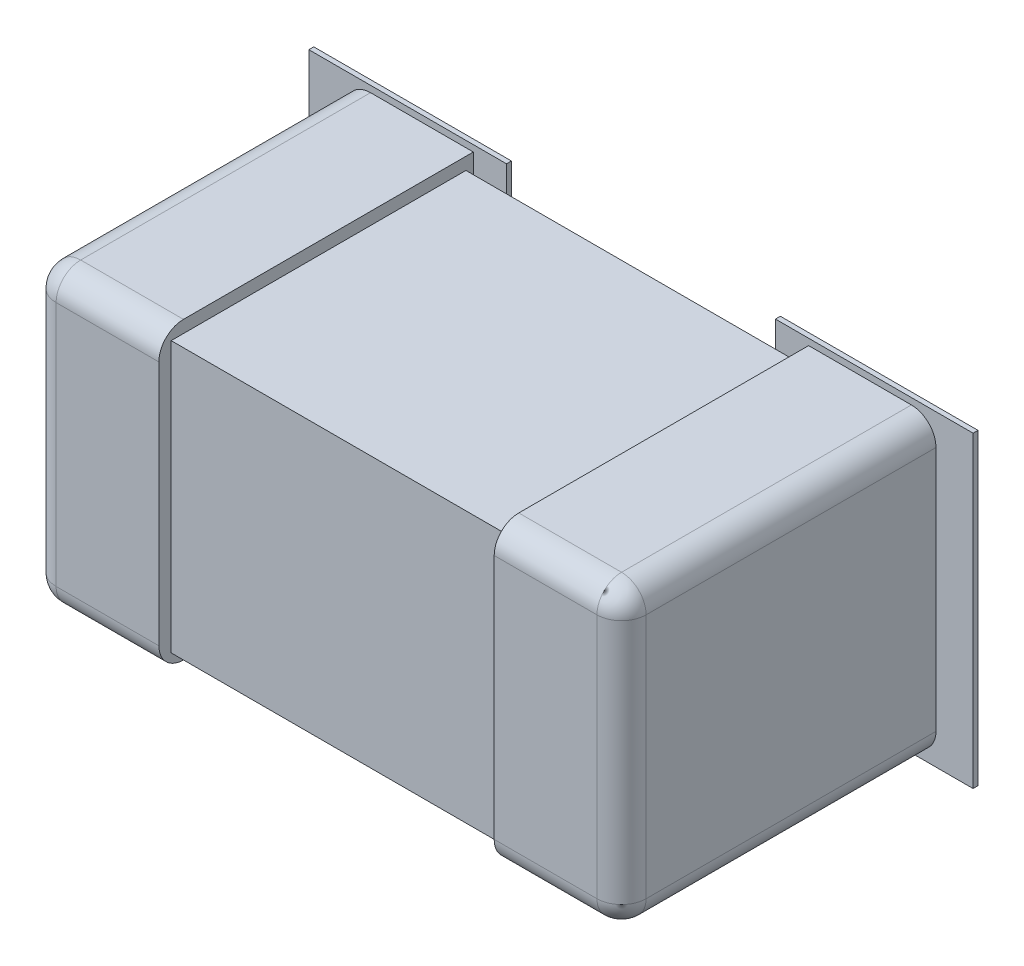
ISO-10303-21;
HEADER;
FILE_DESCRIPTION(('STEP AP214'),'2;1');
FILE_NAME('part.step','',(''),(''),'','','');
FILE_SCHEMA(('AUTOMOTIVE_DESIGN { 1 0 10303 214 1 1 1 1 }'));
ENDSEC;
DATA;
#1=APPLICATION_CONTEXT('core data for automotive mechanical design processes');
#2=APPLICATION_PROTOCOL_DEFINITION('international standard','automotive_design',2000,#1);
#3=PRODUCT_CONTEXT('',#1,'mechanical');
#4=PRODUCT('Part','Part','',(#3));
#5=PRODUCT_RELATED_PRODUCT_CATEGORY('part','',(#4));
#6=PRODUCT_DEFINITION_FORMATION('','',#4);
#7=PRODUCT_DEFINITION_CONTEXT('part definition',#1,'design');
#8=PRODUCT_DEFINITION('design','',#6,#7);
#9=PRODUCT_DEFINITION_SHAPE('','',#8);
#10=(LENGTH_UNIT() NAMED_UNIT(*) SI_UNIT(.MILLI.,.METRE.));
#11=(NAMED_UNIT(*) PLANE_ANGLE_UNIT() SI_UNIT($,.RADIAN.));
#12=(NAMED_UNIT(*) SI_UNIT($,.STERADIAN.) SOLID_ANGLE_UNIT());
#13=UNCERTAINTY_MEASURE_WITH_UNIT(LENGTH_MEASURE(1.E-05),#10,'distance_accuracy_value','');
#14=(GEOMETRIC_REPRESENTATION_CONTEXT(3) GLOBAL_UNCERTAINTY_ASSIGNED_CONTEXT((#13)) GLOBAL_UNIT_ASSIGNED_CONTEXT((#10,
#11,#12)) REPRESENTATION_CONTEXT('',''));
#15=CARTESIAN_POINT('',(0.,0.,0.));
#16=DIRECTION('',(0.,0.,1.));
#17=DIRECTION('',(1.,0.,0.));
#18=AXIS2_PLACEMENT_3D('',#15,#16,#17);
#19=CARTESIAN_POINT('',(0.,0.,0.0762));
#20=DIRECTION('',(0.,0.,1.));
#21=DIRECTION('',(1.,0.,0.));
#22=AXIS2_PLACEMENT_3D('',#19,#20,#21);
#23=PLANE('',#22);
#24=DIRECTION('',(1.,0.,0.));
#25=VECTOR('',#24,1.);
#26=CARTESIAN_POINT('',(0.138938,-0.159004,0.0762));
#27=LINE('',#26,#25);
#28=CARTESIAN_POINT('',(0.138938,-0.159004,0.0762));
#29=VERTEX_POINT('',#28);
#30=CARTESIAN_POINT('',(0.343154,-0.159004,0.0762));
#31=VERTEX_POINT('',#30);
#32=EDGE_CURVE('E341',#29,#31,#27,.T.);
#33=ORIENTED_EDGE('',*,*,#32,.F.);
#34=DIRECTION('',(0.,1.,0.));
#35=VECTOR('',#34,1.);
#36=CARTESIAN_POINT('',(0.138938,0.159004,0.0762));
#37=LINE('',#36,#35);
#38=CARTESIAN_POINT('',(0.138938,0.159004,0.0762));
#39=VERTEX_POINT('',#38);
#40=EDGE_CURVE('E347',#39,#29,#37,.F.);
#41=ORIENTED_EDGE('',*,*,#40,.F.);
#42=DIRECTION('',(1.,0.,0.));
#43=VECTOR('',#42,1.);
#44=CARTESIAN_POINT('',(0.343154,0.159004,0.0762));
#45=LINE('',#44,#43);
#46=CARTESIAN_POINT('',(0.343154,0.159004,0.0762));
#47=VERTEX_POINT('',#46);
#48=EDGE_CURVE('E326',#47,#39,#45,.F.);
#49=ORIENTED_EDGE('',*,*,#48,.F.);
#50=DIRECTION('',(0.,1.,0.));
#51=VECTOR('',#50,1.);
#52=CARTESIAN_POINT('',(0.343154,-0.159004,0.0762));
#53=LINE('',#52,#51);
#54=EDGE_CURVE('E335',#31,#47,#53,.T.);
#55=ORIENTED_EDGE('',*,*,#54,.F.);
#56=EDGE_LOOP('',(#33,#41,#49,#55));
#57=FACE_BOUND('',#56,.T.);
#58=ADVANCED_FACE('F17',(#57),#23,.F.);
#59=CARTESIAN_POINT('',(0.2794,0.127,0.380746));
#60=DIRECTION('',(0.,0.707106781186548,0.707106781186548));
#61=DIRECTION('',(1.,0.,0.));
#62=AXIS2_PLACEMENT_3D('',#59,#60,#61);
#63=SPHERICAL_SURFACE('',#62,0.0254);
#64=CARTESIAN_POINT('',(0.2794,0.127,0.380746));
#65=DIRECTION('',(-1.,0.,0.));
#66=DIRECTION('',(0.,0.,1.));
#67=AXIS2_PLACEMENT_3D('',#64,#65,#66);
#68=CIRCLE('',#67,0.0254);
#69=CARTESIAN_POINT('',(0.2794,0.127,0.406146));
#70=VERTEX_POINT('',#69);
#71=CARTESIAN_POINT('',(0.2794,0.144960512242138,0.398706512242138));
#72=VERTEX_POINT('',#71);
#73=EDGE_CURVE('E313',#70,#72,#68,.T.);
#74=ORIENTED_EDGE('',*,*,#73,.F.);
#75=CARTESIAN_POINT('',(0.2794,0.127,0.380746));
#76=DIRECTION('',(0.,1.,0.));
#77=DIRECTION('',(0.,0.,1.));
#78=AXIS2_PLACEMENT_3D('',#75,#76,#77);
#79=CIRCLE('',#78,0.0254);
#80=CARTESIAN_POINT('',(0.3048,0.127,0.380746));
#81=VERTEX_POINT('',#80);
#82=EDGE_CURVE('E319',#81,#70,#79,.F.);
#83=ORIENTED_EDGE('',*,*,#82,.F.);
#84=CARTESIAN_POINT('',(0.2794,0.127,0.380746));
#85=DIRECTION('',(0.,0.,-1.));
#86=DIRECTION('',(-1.,0.,0.));
#87=AXIS2_PLACEMENT_3D('',#84,#85,#86);
#88=CIRCLE('',#87,0.0254);
#89=CARTESIAN_POINT('',(0.2794,0.1524,0.380746));
#90=VERTEX_POINT('',#89);
#91=EDGE_CURVE('E20',#90,#81,#88,.T.);
#92=ORIENTED_EDGE('',*,*,#91,.F.);
#93=CARTESIAN_POINT('',(0.2794,0.127,0.380746));
#94=DIRECTION('',(-1.,0.,0.));
#95=DIRECTION('',(0.,0.,1.));
#96=AXIS2_PLACEMENT_3D('',#93,#94,#95);
#97=CIRCLE('',#96,0.0254);
#98=EDGE_CURVE('E56',#72,#90,#97,.T.);
#99=ORIENTED_EDGE('',*,*,#98,.F.);
#100=EDGE_LOOP('',(#74,#83,#92,#99));
#101=FACE_BOUND('',#100,.T.);
#102=ADVANCED_FACE('F373',(#101),#63,.T.);
#103=CARTESIAN_POINT('',(0.2794,-0.127,0.380746));
#104=DIRECTION('',(0.707106781186548,0.,0.707106781186548));
#105=DIRECTION('',(0.,-1.,0.));
#106=AXIS2_PLACEMENT_3D('',#103,#104,#105);
#107=SPHERICAL_SURFACE('',#106,0.0254);
#108=CARTESIAN_POINT('',(0.2794,-0.127,0.380746));
#109=DIRECTION('',(0.,1.,0.));
#110=DIRECTION('',(0.,0.,1.));
#111=AXIS2_PLACEMENT_3D('',#108,#109,#110);
#112=CIRCLE('',#111,0.0254);
#113=CARTESIAN_POINT('',(0.2794,-0.127,0.406146));
#114=VERTEX_POINT('',#113);
#115=CARTESIAN_POINT('',(0.297360512242138,-0.127,0.398706512242138));
#116=VERTEX_POINT('',#115);
#117=EDGE_CURVE('E35',#114,#116,#112,.T.);
#118=ORIENTED_EDGE('',*,*,#117,.F.);
#119=CARTESIAN_POINT('',(0.2794,-0.127,0.380746));
#120=DIRECTION('',(1.,0.,0.));
#121=DIRECTION('',(0.,0.,-1.));
#122=AXIS2_PLACEMENT_3D('',#119,#120,#121);
#123=CIRCLE('',#122,0.0254);
#124=CARTESIAN_POINT('',(0.2794,-0.1524,0.380746));
#125=VERTEX_POINT('',#124);
#126=EDGE_CURVE('E398',#125,#114,#123,.F.);
#127=ORIENTED_EDGE('',*,*,#126,.F.);
#128=CARTESIAN_POINT('',(0.2794,-0.127,0.380746));
#129=DIRECTION('',(0.,0.,-1.));
#130=DIRECTION('',(-1.,0.,0.));
#131=AXIS2_PLACEMENT_3D('',#128,#129,#130);
#132=CIRCLE('',#131,0.0254);
#133=CARTESIAN_POINT('',(0.3048,-0.127,0.380746));
#134=VERTEX_POINT('',#133);
#135=EDGE_CURVE('E323',#134,#125,#132,.T.);
#136=ORIENTED_EDGE('',*,*,#135,.F.);
#137=CARTESIAN_POINT('',(0.2794,-0.127,0.380746));
#138=DIRECTION('',(0.,1.,0.));
#139=DIRECTION('',(0.,0.,1.));
#140=AXIS2_PLACEMENT_3D('',#137,#138,#139);
#141=CIRCLE('',#140,0.0254);
#142=EDGE_CURVE('E318',#116,#134,#141,.T.);
#143=ORIENTED_EDGE('',*,*,#142,.F.);
#144=EDGE_LOOP('',(#118,#127,#136,#143));
#145=FACE_BOUND('',#144,.T.);
#146=ADVANCED_FACE('F369',(#145),#107,.T.);
#147=CARTESIAN_POINT('',(0.,0.,0.0762));
#148=DIRECTION('',(0.,0.,1.));
#149=DIRECTION('',(1.,0.,0.));
#150=AXIS2_PLACEMENT_3D('',#147,#148,#149);
#151=PLANE('',#150);
#152=DIRECTION('',(1.,0.,0.));
#153=VECTOR('',#152,1.);
#154=CARTESIAN_POINT('',(-0.138938,0.159004,0.0762));
#155=LINE('',#154,#153);
#156=CARTESIAN_POINT('',(-0.138938,0.159004,0.0762));
#157=VERTEX_POINT('',#156);
#158=CARTESIAN_POINT('',(-0.343154,0.159004,0.0762));
#159=VERTEX_POINT('',#158);
#160=EDGE_CURVE('E302',#157,#159,#155,.F.);
#161=ORIENTED_EDGE('',*,*,#160,.F.);
#162=DIRECTION('',(0.,1.,0.));
#163=VECTOR('',#162,1.);
#164=CARTESIAN_POINT('',(-0.138938,-0.159004,0.0762));
#165=LINE('',#164,#163);
#166=CARTESIAN_POINT('',(-0.138938,-0.159004,0.0762));
#167=VERTEX_POINT('',#166);
#168=EDGE_CURVE('E308',#167,#157,#165,.T.);
#169=ORIENTED_EDGE('',*,*,#168,.F.);
#170=DIRECTION('',(1.,0.,0.));
#171=VECTOR('',#170,1.);
#172=CARTESIAN_POINT('',(-0.343154,-0.159004,0.0762));
#173=LINE('',#172,#171);
#174=CARTESIAN_POINT('',(-0.343154,-0.159004,0.0762));
#175=VERTEX_POINT('',#174);
#176=EDGE_CURVE('E287',#175,#167,#173,.T.);
#177=ORIENTED_EDGE('',*,*,#176,.F.);
#178=DIRECTION('',(0.,1.,0.));
#179=VECTOR('',#178,1.);
#180=CARTESIAN_POINT('',(-0.343154,0.159004,0.0762));
#181=LINE('',#180,#179);
#182=EDGE_CURVE('E296',#159,#175,#181,.F.);
#183=ORIENTED_EDGE('',*,*,#182,.F.);
#184=EDGE_LOOP('',(#161,#169,#177,#183));
#185=FACE_BOUND('',#184,.T.);
#186=ADVANCED_FACE('F365',(#185),#151,.F.);
#187=CARTESIAN_POINT('',(-0.2794,-0.127,0.380746));
#188=DIRECTION('',(0.,-0.707106781186548,0.707106781186548));
#189=DIRECTION('',(-1.,0.,0.));
#190=AXIS2_PLACEMENT_3D('',#187,#188,#189);
#191=SPHERICAL_SURFACE('',#190,0.0254);
#192=CARTESIAN_POINT('',(-0.2794,-0.127,0.380746));
#193=DIRECTION('',(1.,0.,0.));
#194=DIRECTION('',(0.,0.,-1.));
#195=AXIS2_PLACEMENT_3D('',#192,#193,#194);
#196=CIRCLE('',#195,0.0254);
#197=CARTESIAN_POINT('',(-0.2794,-0.127,0.406146));
#198=VERTEX_POINT('',#197);
#199=CARTESIAN_POINT('',(-0.2794,-0.144960512242138,0.398706512242138));
#200=VERTEX_POINT('',#199);
#201=EDGE_CURVE('E271',#198,#200,#196,.T.);
#202=ORIENTED_EDGE('',*,*,#201,.F.);
#203=CARTESIAN_POINT('',(-0.2794,-0.127,0.380746));
#204=DIRECTION('',(0.,-1.,0.));
#205=DIRECTION('',(0.,0.,-1.));
#206=AXIS2_PLACEMENT_3D('',#203,#204,#205);
#207=CIRCLE('',#206,0.0254);
#208=CARTESIAN_POINT('',(-0.3048,-0.127,0.380746));
#209=VERTEX_POINT('',#208);
#210=EDGE_CURVE('E285',#209,#198,#207,.F.);
#211=ORIENTED_EDGE('',*,*,#210,.F.);
#212=CARTESIAN_POINT('',(-0.2794,-0.127,0.380746));
#213=DIRECTION('',(0.,0.,-1.));
#214=DIRECTION('',(-1.,0.,0.));
#215=AXIS2_PLACEMENT_3D('',#212,#213,#214);
#216=CIRCLE('',#215,0.0254);
#217=CARTESIAN_POINT('',(-0.2794,-0.1524,0.380746));
#218=VERTEX_POINT('',#217);
#219=EDGE_CURVE('E286',#218,#209,#216,.T.);
#220=ORIENTED_EDGE('',*,*,#219,.F.);
#221=CARTESIAN_POINT('',(-0.2794,-0.127,0.380746));
#222=DIRECTION('',(1.,0.,0.));
#223=DIRECTION('',(0.,0.,-1.));
#224=AXIS2_PLACEMENT_3D('',#221,#222,#223);
#225=CIRCLE('',#224,0.0254);
#226=EDGE_CURVE('E273',#200,#218,#225,.T.);
#227=ORIENTED_EDGE('',*,*,#226,.F.);
#228=EDGE_LOOP('',(#202,#211,#220,#227));
#229=FACE_BOUND('',#228,.T.);
#230=ADVANCED_FACE('F360',(#229),#191,.T.);
#231=CARTESIAN_POINT('',(-0.2794,0.127,0.380746));
#232=DIRECTION('',(-0.707106781186548,0.707106781186548,0.));
#233=DIRECTION('',(0.,0.,1.));
#234=AXIS2_PLACEMENT_3D('',#231,#232,#233);
#235=SPHERICAL_SURFACE('',#234,0.0254);
#236=CARTESIAN_POINT('',(-0.2794,0.127,0.380746));
#237=DIRECTION('',(0.,-1.,0.));
#238=DIRECTION('',(0.,0.,-1.));
#239=AXIS2_PLACEMENT_3D('',#236,#237,#238);
#240=CIRCLE('',#239,0.0254);
#241=CARTESIAN_POINT('',(-0.2794,0.127,0.406146));
#242=VERTEX_POINT('',#241);
#243=CARTESIAN_POINT('',(-0.3048,0.127,0.380746));
#244=VERTEX_POINT('',#243);
#245=EDGE_CURVE('E393',#242,#244,#240,.T.);
#246=ORIENTED_EDGE('',*,*,#245,.F.);
#247=CARTESIAN_POINT('',(-0.2794,0.127,0.380746));
#248=DIRECTION('',(-1.,0.,0.));
#249=DIRECTION('',(0.,0.,1.));
#250=AXIS2_PLACEMENT_3D('',#247,#248,#249);
#251=CIRCLE('',#250,0.0254);
#252=CARTESIAN_POINT('',(-0.2794,0.1524,0.380746));
#253=VERTEX_POINT('',#252);
#254=EDGE_CURVE('E388',#253,#242,#251,.F.);
#255=ORIENTED_EDGE('',*,*,#254,.F.);
#256=CARTESIAN_POINT('',(-0.2794,0.127,0.380746));
#257=DIRECTION('',(0.,0.,-1.));
#258=DIRECTION('',(-1.,0.,0.));
#259=AXIS2_PLACEMENT_3D('',#256,#257,#258);
#260=CIRCLE('',#259,0.0254);
#261=CARTESIAN_POINT('',(-0.297360512242138,0.144960512242138,0.380746));
#262=VERTEX_POINT('',#261);
#263=EDGE_CURVE('E269',#262,#253,#260,.T.);
#264=ORIENTED_EDGE('',*,*,#263,.F.);
#265=CARTESIAN_POINT('',(-0.2794,0.127,0.380746));
#266=DIRECTION('',(0.,0.,-1.));
#267=DIRECTION('',(-1.,0.,0.));
#268=AXIS2_PLACEMENT_3D('',#265,#266,#267);
#269=CIRCLE('',#268,0.0254);
#270=EDGE_CURVE('E267',#244,#262,#269,.T.);
#271=ORIENTED_EDGE('',*,*,#270,.F.);
#272=EDGE_LOOP('',(#246,#255,#264,#271));
#273=FACE_BOUND('',#272,.T.);
#274=ADVANCED_FACE('F355',(#273),#235,.T.);
#275=CARTESIAN_POINT('',(0.138938,0.159004,0.0762));
#276=DIRECTION('',(-1.,0.,0.));
#277=DIRECTION('',(0.,0.,1.));
#278=AXIS2_PLACEMENT_3D('',#275,#276,#277);
#279=PLANE('',#278);
#280=DIRECTION('',(0.,0.,1.));
#281=VECTOR('',#280,1.);
#282=CARTESIAN_POINT('',(0.138938,0.159004,0.0762));
#283=LINE('',#282,#281);
#284=CARTESIAN_POINT('',(0.138938,0.159004,0.08128));
#285=VERTEX_POINT('',#284);
#286=EDGE_CURVE('E332',#39,#285,#283,.T.);
#287=ORIENTED_EDGE('',*,*,#286,.F.);
#288=ORIENTED_EDGE('',*,*,#40,.T.);
#289=DIRECTION('',(0.,0.,-1.));
#290=VECTOR('',#289,1.);
#291=CARTESIAN_POINT('',(0.138938,-0.159004,0.0762));
#292=LINE('',#291,#290);
#293=CARTESIAN_POINT('',(0.138938,-0.159004,0.08128));
#294=VERTEX_POINT('',#293);
#295=EDGE_CURVE('E344',#294,#29,#292,.T.);
#296=ORIENTED_EDGE('',*,*,#295,.F.);
#297=DIRECTION('',(0.,1.,0.));
#298=VECTOR('',#297,1.);
#299=CARTESIAN_POINT('',(0.138938,0.,0.08128));
#300=LINE('',#299,#298);
#301=EDGE_CURVE('E261',#285,#294,#300,.F.);
#302=ORIENTED_EDGE('',*,*,#301,.F.);
#303=EDGE_LOOP('',(#287,#288,#296,#302));
#304=FACE_BOUND('',#303,.T.);
#305=ADVANCED_FACE('F359',(#304),#279,.T.);
#306=CARTESIAN_POINT('',(0.138938,-0.159004,0.0762));
#307=DIRECTION('',(0.,-1.,0.));
#308=DIRECTION('',(0.,0.,-1.));
#309=AXIS2_PLACEMENT_3D('',#306,#307,#308);
#310=PLANE('',#309);
#311=ORIENTED_EDGE('',*,*,#295,.T.);
#312=ORIENTED_EDGE('',*,*,#32,.T.);
#313=DIRECTION('',(0.,0.,-1.));
#314=VECTOR('',#313,1.);
#315=CARTESIAN_POINT('',(0.343154,-0.159004,0.0762));
#316=LINE('',#315,#314);
#317=CARTESIAN_POINT('',(0.343154,-0.159004,0.08128));
#318=VERTEX_POINT('',#317);
#319=EDGE_CURVE('E338',#318,#31,#316,.T.);
#320=ORIENTED_EDGE('',*,*,#319,.F.);
#321=DIRECTION('',(1.,0.,0.));
#322=VECTOR('',#321,1.);
#323=CARTESIAN_POINT('',(0.,-0.159004,0.08128));
#324=LINE('',#323,#322);
#325=EDGE_CURVE('E258',#294,#318,#324,.T.);
#326=ORIENTED_EDGE('',*,*,#325,.F.);
#327=EDGE_LOOP('',(#311,#312,#320,#326));
#328=FACE_BOUND('',#327,.T.);
#329=ADVANCED_FACE('F529',(#328),#310,.T.);
#330=CARTESIAN_POINT('',(0.343154,-0.159004,0.0762));
#331=DIRECTION('',(1.,0.,0.));
#332=DIRECTION('',(0.,0.,-1.));
#333=AXIS2_PLACEMENT_3D('',#330,#331,#332);
#334=PLANE('',#333);
#335=ORIENTED_EDGE('',*,*,#319,.T.);
#336=ORIENTED_EDGE('',*,*,#54,.T.);
#337=DIRECTION('',(0.,0.,1.));
#338=VECTOR('',#337,1.);
#339=CARTESIAN_POINT('',(0.343154,0.159004,0.0762));
#340=LINE('',#339,#338);
#341=CARTESIAN_POINT('',(0.343154,0.159004,0.08128));
#342=VERTEX_POINT('',#341);
#343=EDGE_CURVE('E329',#342,#47,#340,.F.);
#344=ORIENTED_EDGE('',*,*,#343,.F.);
#345=DIRECTION('',(0.,1.,0.));
#346=VECTOR('',#345,1.);
#347=CARTESIAN_POINT('',(0.343154,0.,0.08128));
#348=LINE('',#347,#346);
#349=EDGE_CURVE('E255',#318,#342,#348,.T.);
#350=ORIENTED_EDGE('',*,*,#349,.F.);
#351=EDGE_LOOP('',(#335,#336,#344,#350));
#352=FACE_BOUND('',#351,.T.);
#353=ADVANCED_FACE('F531',(#352),#334,.T.);
#354=CARTESIAN_POINT('',(0.343154,0.159004,0.0762));
#355=DIRECTION('',(0.,1.,0.));
#356=DIRECTION('',(0.,0.,1.));
#357=AXIS2_PLACEMENT_3D('',#354,#355,#356);
#358=PLANE('',#357);
#359=ORIENTED_EDGE('',*,*,#343,.T.);
#360=ORIENTED_EDGE('',*,*,#48,.T.);
#361=ORIENTED_EDGE('',*,*,#286,.T.);
#362=DIRECTION('',(1.,0.,0.));
#363=VECTOR('',#362,1.);
#364=CARTESIAN_POINT('',(0.,0.159004,0.08128));
#365=LINE('',#364,#363);
#366=EDGE_CURVE('E252',#342,#285,#365,.F.);
#367=ORIENTED_EDGE('',*,*,#366,.F.);
#368=EDGE_LOOP('',(#359,#360,#361,#367));
#369=FACE_BOUND('',#368,.T.);
#370=ADVANCED_FACE('F533',(#369),#358,.T.);
#371=CARTESIAN_POINT('',(0.3048,-0.1524,0.0762));
#372=DIRECTION('',(1.,0.,0.));
#373=DIRECTION('',(0.,0.,-1.));
#374=AXIS2_PLACEMENT_3D('',#371,#372,#373);
#375=PLANE('',#374);
#376=DIRECTION('',(0.,0.,-1.));
#377=VECTOR('',#376,1.);
#378=CARTESIAN_POINT('',(0.3048,-0.127,0.8362636056));
#379=LINE('',#378,#377);
#380=CARTESIAN_POINT('',(0.3048,-0.127,0.08128));
#381=VERTEX_POINT('',#380);
#382=EDGE_CURVE('E148',#381,#134,#379,.F.);
#383=ORIENTED_EDGE('',*,*,#382,.F.);
#384=DIRECTION('',(0.,1.,0.));
#385=VECTOR('',#384,1.);
#386=CARTESIAN_POINT('',(0.3048,0.,0.08128));
#387=LINE('',#386,#385);
#388=CARTESIAN_POINT('',(0.3048,0.127,0.08128));
#389=VERTEX_POINT('',#388);
#390=EDGE_CURVE('E67',#389,#381,#387,.F.);
#391=ORIENTED_EDGE('',*,*,#390,.F.);
#392=DIRECTION('',(0.,0.,-1.));
#393=VECTOR('',#392,1.);
#394=CARTESIAN_POINT('',(0.3048,0.127,0.8362636056));
#395=LINE('',#394,#393);
#396=EDGE_CURVE('E324',#81,#389,#395,.T.);
#397=ORIENTED_EDGE('',*,*,#396,.F.);
#398=DIRECTION('',(0.,1.,0.));
#399=VECTOR('',#398,1.);
#400=CARTESIAN_POINT('',(0.3048,-0.5735592288,0.380746));
#401=LINE('',#400,#399);
#402=EDGE_CURVE('E315',#134,#81,#401,.T.);
#403=ORIENTED_EDGE('',*,*,#402,.F.);
#404=EDGE_LOOP('',(#383,#391,#397,#403));
#405=FACE_BOUND('',#404,.T.);
#406=ADVANCED_FACE('F436',(#405),#375,.T.);
#407=CARTESIAN_POINT('',(0.2794,0.127,0.8362636056));
#408=DIRECTION('',(0.,0.,-1.));
#409=DIRECTION('',(-1.,0.,0.));
#410=AXIS2_PLACEMENT_3D('',#407,#408,#409);
#411=CYLINDRICAL_SURFACE('',#410,0.0254);
#412=ORIENTED_EDGE('',*,*,#396,.T.);
#413=CARTESIAN_POINT('',(0.2794,0.127,0.08128));
#414=DIRECTION('',(0.,0.,-1.));
#415=DIRECTION('',(-1.,0.,0.));
#416=AXIS2_PLACEMENT_3D('',#413,#414,#415);
#417=CIRCLE('',#416,0.0254);
#418=CARTESIAN_POINT('',(0.2794,0.1524,0.08128));
#419=VERTEX_POINT('',#418);
#420=EDGE_CURVE('E251',#419,#389,#417,.T.);
#421=ORIENTED_EDGE('',*,*,#420,.F.);
#422=DIRECTION('',(0.,0.,1.));
#423=VECTOR('',#422,1.);
#424=CARTESIAN_POINT('',(0.2794,0.1524,0.0762));
#425=LINE('',#424,#423);
#426=EDGE_CURVE('E244',#90,#419,#425,.F.);
#427=ORIENTED_EDGE('',*,*,#426,.F.);
#428=ORIENTED_EDGE('',*,*,#91,.T.);
#429=EDGE_LOOP('',(#412,#421,#427,#428));
#430=FACE_BOUND('',#429,.T.);
#431=ADVANCED_FACE('F414',(#430),#411,.T.);
#432=CARTESIAN_POINT('',(0.2794,-0.5735592288,0.380746));
#433=DIRECTION('',(0.,1.,0.));
#434=DIRECTION('',(0.,0.,1.));
#435=AXIS2_PLACEMENT_3D('',#432,#433,#434);
#436=CYLINDRICAL_SURFACE('',#435,0.0254);
#437=ORIENTED_EDGE('',*,*,#142,.T.);
#438=ORIENTED_EDGE('',*,*,#402,.T.);
#439=ORIENTED_EDGE('',*,*,#82,.T.);
#440=DIRECTION('',(0.,1.,0.));
#441=VECTOR('',#440,1.);
#442=CARTESIAN_POINT('',(0.2794,0.,0.406146));
#443=LINE('',#442,#441);
#444=EDGE_CURVE('E156',#114,#70,#443,.T.);
#445=ORIENTED_EDGE('',*,*,#444,.F.);
#446=ORIENTED_EDGE('',*,*,#117,.T.);
#447=EDGE_LOOP('',(#437,#438,#439,#445,#446));
#448=FACE_BOUND('',#447,.T.);
#449=ADVANCED_FACE('F405',(#448),#436,.T.);
#450=CARTESIAN_POINT('',(1.2378251088,0.127,0.380746));
#451=DIRECTION('',(-1.,0.,0.));
#452=DIRECTION('',(0.,0.,1.));
#453=AXIS2_PLACEMENT_3D('',#450,#451,#452);
#454=CYLINDRICAL_SURFACE('',#453,0.0254);
#455=DIRECTION('',(1.,0.,0.));
#456=VECTOR('',#455,1.);
#457=CARTESIAN_POINT('',(0.3048,0.1524,0.380746));
#458=LINE('',#457,#456);
#459=CARTESIAN_POINT('',(0.173228,0.1524,0.380746));
#460=VERTEX_POINT('',#459);
#461=EDGE_CURVE('E143',#460,#90,#458,.T.);
#462=ORIENTED_EDGE('',*,*,#461,.F.);
#463=CARTESIAN_POINT('',(0.173228,0.127,0.380746));
#464=DIRECTION('',(-1.,0.,0.));
#465=DIRECTION('',(0.,0.,1.));
#466=AXIS2_PLACEMENT_3D('',#463,#464,#465);
#467=CIRCLE('',#466,0.0254);
#468=CARTESIAN_POINT('',(0.173228,0.127,0.406146));
#469=VERTEX_POINT('',#468);
#470=EDGE_CURVE('E139',#460,#469,#467,.F.);
#471=ORIENTED_EDGE('',*,*,#470,.T.);
#472=DIRECTION('',(1.,0.,0.));
#473=VECTOR('',#472,1.);
#474=CARTESIAN_POINT('',(0.,0.127,0.406146));
#475=LINE('',#474,#473);
#476=EDGE_CURVE('E142',#70,#469,#475,.F.);
#477=ORIENTED_EDGE('',*,*,#476,.F.);
#478=ORIENTED_EDGE('',*,*,#73,.T.);
#479=ORIENTED_EDGE('',*,*,#98,.T.);
#480=EDGE_LOOP('',(#462,#471,#477,#478,#479));
#481=FACE_BOUND('',#480,.T.);
#482=ADVANCED_FACE('F141',(#481),#454,.T.);
#483=CARTESIAN_POINT('',(0.2794,-0.127,0.8362636056));
#484=DIRECTION('',(0.,0.,-1.));
#485=DIRECTION('',(-1.,0.,0.));
#486=AXIS2_PLACEMENT_3D('',#483,#484,#485);
#487=CYLINDRICAL_SURFACE('',#486,0.0254);
#488=DIRECTION('',(0.,0.,-1.));
#489=VECTOR('',#488,1.);
#490=CARTESIAN_POINT('',(0.2794,-0.1524,0.0762));
#491=LINE('',#490,#489);
#492=CARTESIAN_POINT('',(0.2794,-0.1524,0.08128));
#493=VERTEX_POINT('',#492);
#494=EDGE_CURVE('E157',#493,#125,#491,.F.);
#495=ORIENTED_EDGE('',*,*,#494,.F.);
#496=CARTESIAN_POINT('',(0.2794,-0.127,0.08128));
#497=DIRECTION('',(0.,0.,-1.));
#498=DIRECTION('',(-1.,0.,0.));
#499=AXIS2_PLACEMENT_3D('',#496,#497,#498);
#500=CIRCLE('',#499,0.0254);
#501=EDGE_CURVE('E245',#381,#493,#500,.T.);
#502=ORIENTED_EDGE('',*,*,#501,.F.);
#503=ORIENTED_EDGE('',*,*,#382,.T.);
#504=ORIENTED_EDGE('',*,*,#135,.T.);
#505=EDGE_LOOP('',(#495,#502,#503,#504));
#506=FACE_BOUND('',#505,.T.);
#507=ADVANCED_FACE('F434',(#506),#487,.T.);
#508=CARTESIAN_POINT('',(-1.2378251088,-0.127,0.380746));
#509=DIRECTION('',(1.,0.,0.));
#510=DIRECTION('',(0.,0.,-1.));
#511=AXIS2_PLACEMENT_3D('',#508,#509,#510);
#512=CYLINDRICAL_SURFACE('',#511,0.0254);
#513=DIRECTION('',(1.,0.,0.));
#514=VECTOR('',#513,1.);
#515=CARTESIAN_POINT('',(0.,-0.127,0.406146));
#516=LINE('',#515,#514);
#517=CARTESIAN_POINT('',(0.173228,-0.127,0.406146));
#518=VERTEX_POINT('',#517);
#519=EDGE_CURVE('E240',#518,#114,#516,.T.);
#520=ORIENTED_EDGE('',*,*,#519,.F.);
#521=CARTESIAN_POINT('',(0.173228,-0.127,0.380746));
#522=DIRECTION('',(1.,0.,0.));
#523=DIRECTION('',(0.,0.,-1.));
#524=AXIS2_PLACEMENT_3D('',#521,#522,#523);
#525=CIRCLE('',#524,0.0254);
#526=CARTESIAN_POINT('',(0.173228,-0.1524,0.380746));
#527=VERTEX_POINT('',#526);
#528=EDGE_CURVE('E161',#518,#527,#525,.T.);
#529=ORIENTED_EDGE('',*,*,#528,.T.);
#530=DIRECTION('',(1.,0.,0.));
#531=VECTOR('',#530,1.);
#532=CARTESIAN_POINT('',(-0.3048,-0.1524,0.380746));
#533=LINE('',#532,#531);
#534=EDGE_CURVE('E229',#125,#527,#533,.F.);
#535=ORIENTED_EDGE('',*,*,#534,.F.);
#536=ORIENTED_EDGE('',*,*,#126,.T.);
#537=EDGE_LOOP('',(#520,#529,#535,#536));
#538=FACE_BOUND('',#537,.T.);
#539=ADVANCED_FACE('F431',(#538),#512,.T.);
#540=CARTESIAN_POINT('',(-0.138938,-0.159004,0.0762));
#541=DIRECTION('',(1.,0.,0.));
#542=DIRECTION('',(0.,0.,-1.));
#543=AXIS2_PLACEMENT_3D('',#540,#541,#542);
#544=PLANE('',#543);
#545=DIRECTION('',(0.,0.,-1.));
#546=VECTOR('',#545,1.);
#547=CARTESIAN_POINT('',(-0.138938,-0.159004,0.0762));
#548=LINE('',#547,#546);
#549=CARTESIAN_POINT('',(-0.138938,-0.159004,0.08128));
#550=VERTEX_POINT('',#549);
#551=EDGE_CURVE('E293',#167,#550,#548,.F.);
#552=ORIENTED_EDGE('',*,*,#551,.F.);
#553=ORIENTED_EDGE('',*,*,#168,.T.);
#554=DIRECTION('',(0.,0.,1.));
#555=VECTOR('',#554,1.);
#556=CARTESIAN_POINT('',(-0.138938,0.159004,0.0762));
#557=LINE('',#556,#555);
#558=CARTESIAN_POINT('',(-0.138938,0.159004,0.08128));
#559=VERTEX_POINT('',#558);
#560=EDGE_CURVE('E305',#559,#157,#557,.F.);
#561=ORIENTED_EDGE('',*,*,#560,.F.);
#562=DIRECTION('',(0.,1.,0.));
#563=VECTOR('',#562,1.);
#564=CARTESIAN_POINT('',(-0.138938,0.,0.08128));
#565=LINE('',#564,#563);
#566=EDGE_CURVE('E225',#550,#559,#565,.T.);
#567=ORIENTED_EDGE('',*,*,#566,.F.);
#568=EDGE_LOOP('',(#552,#553,#561,#567));
#569=FACE_BOUND('',#568,.T.);
#570=ADVANCED_FACE('F493',(#569),#544,.T.);
#571=CARTESIAN_POINT('',(-0.138938,0.159004,0.0762));
#572=DIRECTION('',(0.,1.,0.));
#573=DIRECTION('',(0.,0.,1.));
#574=AXIS2_PLACEMENT_3D('',#571,#572,#573);
#575=PLANE('',#574);
#576=ORIENTED_EDGE('',*,*,#560,.T.);
#577=ORIENTED_EDGE('',*,*,#160,.T.);
#578=DIRECTION('',(0.,0.,1.));
#579=VECTOR('',#578,1.);
#580=CARTESIAN_POINT('',(-0.343154,0.159004,0.0762));
#581=LINE('',#580,#579);
#582=CARTESIAN_POINT('',(-0.343154,0.159004,0.08128));
#583=VERTEX_POINT('',#582);
#584=EDGE_CURVE('E299',#583,#159,#581,.F.);
#585=ORIENTED_EDGE('',*,*,#584,.F.);
#586=DIRECTION('',(1.,0.,0.));
#587=VECTOR('',#586,1.);
#588=CARTESIAN_POINT('',(0.,0.159004,0.08128));
#589=LINE('',#588,#587);
#590=EDGE_CURVE('E222',#559,#583,#589,.F.);
#591=ORIENTED_EDGE('',*,*,#590,.F.);
#592=EDGE_LOOP('',(#576,#577,#585,#591));
#593=FACE_BOUND('',#592,.T.);
#594=ADVANCED_FACE('F500',(#593),#575,.T.);
#595=CARTESIAN_POINT('',(-0.343154,0.159004,0.0762));
#596=DIRECTION('',(-1.,0.,0.));
#597=DIRECTION('',(0.,0.,1.));
#598=AXIS2_PLACEMENT_3D('',#595,#596,#597);
#599=PLANE('',#598);
#600=ORIENTED_EDGE('',*,*,#584,.T.);
#601=ORIENTED_EDGE('',*,*,#182,.T.);
#602=DIRECTION('',(0.,0.,-1.));
#603=VECTOR('',#602,1.);
#604=CARTESIAN_POINT('',(-0.343154,-0.159004,0.0762));
#605=LINE('',#604,#603);
#606=CARTESIAN_POINT('',(-0.343154,-0.159004,0.08128));
#607=VERTEX_POINT('',#606);
#608=EDGE_CURVE('E290',#607,#175,#605,.T.);
#609=ORIENTED_EDGE('',*,*,#608,.F.);
#610=DIRECTION('',(0.,1.,0.));
#611=VECTOR('',#610,1.);
#612=CARTESIAN_POINT('',(-0.343154,0.,0.08128));
#613=LINE('',#612,#611);
#614=EDGE_CURVE('E219',#583,#607,#613,.F.);
#615=ORIENTED_EDGE('',*,*,#614,.F.);
#616=EDGE_LOOP('',(#600,#601,#609,#615));
#617=FACE_BOUND('',#616,.T.);
#618=ADVANCED_FACE('F505',(#617),#599,.T.);
#619=CARTESIAN_POINT('',(-0.343154,-0.159004,0.0762));
#620=DIRECTION('',(0.,-1.,0.));
#621=DIRECTION('',(0.,0.,-1.));
#622=AXIS2_PLACEMENT_3D('',#619,#620,#621);
#623=PLANE('',#622);
#624=ORIENTED_EDGE('',*,*,#608,.T.);
#625=ORIENTED_EDGE('',*,*,#176,.T.);
#626=ORIENTED_EDGE('',*,*,#551,.T.);
#627=DIRECTION('',(1.,0.,0.));
#628=VECTOR('',#627,1.);
#629=CARTESIAN_POINT('',(0.,-0.159004,0.08128));
#630=LINE('',#629,#628);
#631=EDGE_CURVE('E216',#607,#550,#630,.T.);
#632=ORIENTED_EDGE('',*,*,#631,.F.);
#633=EDGE_LOOP('',(#624,#625,#626,#632));
#634=FACE_BOUND('',#633,.T.);
#635=ADVANCED_FACE('F510',(#634),#623,.T.);
#636=CARTESIAN_POINT('',(-0.3048,0.1524,0.0762));
#637=DIRECTION('',(-1.,0.,0.));
#638=DIRECTION('',(0.,0.,1.));
#639=AXIS2_PLACEMENT_3D('',#636,#637,#638);
#640=PLANE('',#639);
#641=DIRECTION('',(0.,0.,-1.));
#642=VECTOR('',#641,1.);
#643=CARTESIAN_POINT('',(-0.3048,0.127,0.8362636056));
#644=LINE('',#643,#642);
#645=CARTESIAN_POINT('',(-0.3048,0.127,0.08128));
#646=VERTEX_POINT('',#645);
#647=EDGE_CURVE('E270',#646,#244,#644,.F.);
#648=ORIENTED_EDGE('',*,*,#647,.F.);
#649=DIRECTION('',(0.,1.,0.));
#650=VECTOR('',#649,1.);
#651=CARTESIAN_POINT('',(-0.3048,0.,0.08128));
#652=LINE('',#651,#650);
#653=CARTESIAN_POINT('',(-0.3048,-0.127,0.08128));
#654=VERTEX_POINT('',#653);
#655=EDGE_CURVE('E212',#654,#646,#652,.T.);
#656=ORIENTED_EDGE('',*,*,#655,.F.);
#657=DIRECTION('',(0.,0.,-1.));
#658=VECTOR('',#657,1.);
#659=CARTESIAN_POINT('',(-0.3048,-0.127,0.8362636056));
#660=LINE('',#659,#658);
#661=EDGE_CURVE('E282',#209,#654,#660,.T.);
#662=ORIENTED_EDGE('',*,*,#661,.F.);
#663=DIRECTION('',(0.,-1.,0.));
#664=VECTOR('',#663,1.);
#665=CARTESIAN_POINT('',(-0.3048,0.5735592288,0.380746));
#666=LINE('',#665,#664);
#667=EDGE_CURVE('E274',#244,#209,#666,.T.);
#668=ORIENTED_EDGE('',*,*,#667,.F.);
#669=EDGE_LOOP('',(#648,#656,#662,#668));
#670=FACE_BOUND('',#669,.T.);
#671=ADVANCED_FACE('F607',(#670),#640,.T.);
#672=CARTESIAN_POINT('',(-0.2794,-0.127,0.8362636056));
#673=DIRECTION('',(0.,0.,-1.));
#674=DIRECTION('',(-1.,0.,0.));
#675=AXIS2_PLACEMENT_3D('',#672,#673,#674);
#676=CYLINDRICAL_SURFACE('',#675,0.0254);
#677=ORIENTED_EDGE('',*,*,#661,.T.);
#678=CARTESIAN_POINT('',(-0.2794,-0.127,0.08128));
#679=DIRECTION('',(0.,0.,-1.));
#680=DIRECTION('',(-1.,0.,0.));
#681=AXIS2_PLACEMENT_3D('',#678,#679,#680);
#682=CIRCLE('',#681,0.0254);
#683=CARTESIAN_POINT('',(-0.2794,-0.1524,0.08128));
#684=VERTEX_POINT('',#683);
#685=EDGE_CURVE('E215',#684,#654,#682,.T.);
#686=ORIENTED_EDGE('',*,*,#685,.F.);
#687=DIRECTION('',(0.,0.,-1.));
#688=VECTOR('',#687,1.);
#689=CARTESIAN_POINT('',(-0.2794,-0.1524,0.0762));
#690=LINE('',#689,#688);
#691=EDGE_CURVE('E206',#218,#684,#690,.T.);
#692=ORIENTED_EDGE('',*,*,#691,.F.);
#693=ORIENTED_EDGE('',*,*,#219,.T.);
#694=EDGE_LOOP('',(#677,#686,#692,#693));
#695=FACE_BOUND('',#694,.T.);
#696=ADVANCED_FACE('F461',(#695),#676,.T.);
#697=CARTESIAN_POINT('',(-0.2794,0.5735592288,0.380746));
#698=DIRECTION('',(0.,-1.,0.));
#699=DIRECTION('',(0.,0.,-1.));
#700=AXIS2_PLACEMENT_3D('',#697,#698,#699);
#701=CYLINDRICAL_SURFACE('',#700,0.0254);
#702=ORIENTED_EDGE('',*,*,#245,.T.);
#703=ORIENTED_EDGE('',*,*,#667,.T.);
#704=ORIENTED_EDGE('',*,*,#210,.T.);
#705=DIRECTION('',(0.,1.,0.));
#706=VECTOR('',#705,1.);
#707=CARTESIAN_POINT('',(-0.2794,0.,0.406146));
#708=LINE('',#707,#706);
#709=EDGE_CURVE('E198',#242,#198,#708,.F.);
#710=ORIENTED_EDGE('',*,*,#709,.F.);
#711=EDGE_LOOP('',(#702,#703,#704,#710));
#712=FACE_BOUND('',#711,.T.);
#713=ADVANCED_FACE('F600',(#712),#701,.T.);
#714=CARTESIAN_POINT('',(-1.2378251088,-0.127,0.380746));
#715=DIRECTION('',(1.,0.,0.));
#716=DIRECTION('',(0.,0.,-1.));
#717=AXIS2_PLACEMENT_3D('',#714,#715,#716);
#718=CYLINDRICAL_SURFACE('',#717,0.0254);
#719=DIRECTION('',(1.,0.,0.));
#720=VECTOR('',#719,1.);
#721=CARTESIAN_POINT('',(-0.3048,-0.1524,0.380746));
#722=LINE('',#721,#720);
#723=CARTESIAN_POINT('',(-0.173228,-0.1524,0.380746));
#724=VERTEX_POINT('',#723);
#725=EDGE_CURVE('E203',#724,#218,#722,.F.);
#726=ORIENTED_EDGE('',*,*,#725,.F.);
#727=CARTESIAN_POINT('',(-0.173228,-0.127,0.380746));
#728=DIRECTION('',(1.,0.,0.));
#729=DIRECTION('',(0.,0.,-1.));
#730=AXIS2_PLACEMENT_3D('',#727,#728,#729);
#731=CIRCLE('',#730,0.0254);
#732=CARTESIAN_POINT('',(-0.173228,-0.127,0.406146));
#733=VERTEX_POINT('',#732);
#734=EDGE_CURVE('E281',#724,#733,#731,.F.);
#735=ORIENTED_EDGE('',*,*,#734,.T.);
#736=DIRECTION('',(1.,0.,0.));
#737=VECTOR('',#736,1.);
#738=CARTESIAN_POINT('',(0.,-0.127,0.406146));
#739=LINE('',#738,#737);
#740=EDGE_CURVE('E195',#198,#733,#739,.T.);
#741=ORIENTED_EDGE('',*,*,#740,.F.);
#742=ORIENTED_EDGE('',*,*,#201,.T.);
#743=ORIENTED_EDGE('',*,*,#226,.T.);
#744=EDGE_LOOP('',(#726,#735,#741,#742,#743));
#745=FACE_BOUND('',#744,.T.);
#746=ADVANCED_FACE('F596',(#745),#718,.T.);
#747=CARTESIAN_POINT('',(-0.2794,0.127,0.8362636056));
#748=DIRECTION('',(0.,0.,-1.));
#749=DIRECTION('',(-1.,0.,0.));
#750=AXIS2_PLACEMENT_3D('',#747,#748,#749);
#751=CYLINDRICAL_SURFACE('',#750,0.0254);
#752=DIRECTION('',(0.,0.,1.));
#753=VECTOR('',#752,1.);
#754=CARTESIAN_POINT('',(-0.2794,0.1524,0.0762));
#755=LINE('',#754,#753);
#756=CARTESIAN_POINT('',(-0.2794,0.1524,0.08128));
#757=VERTEX_POINT('',#756);
#758=EDGE_CURVE('E183',#757,#253,#755,.T.);
#759=ORIENTED_EDGE('',*,*,#758,.F.);
#760=CARTESIAN_POINT('',(-0.2794,0.127,0.08128));
#761=DIRECTION('',(0.,0.,-1.));
#762=DIRECTION('',(-1.,0.,0.));
#763=AXIS2_PLACEMENT_3D('',#760,#761,#762);
#764=CIRCLE('',#763,0.0254);
#765=EDGE_CURVE('E207',#646,#757,#764,.T.);
#766=ORIENTED_EDGE('',*,*,#765,.F.);
#767=ORIENTED_EDGE('',*,*,#647,.T.);
#768=ORIENTED_EDGE('',*,*,#270,.T.);
#769=ORIENTED_EDGE('',*,*,#263,.T.);
#770=EDGE_LOOP('',(#759,#766,#767,#768,#769));
#771=FACE_BOUND('',#770,.T.);
#772=ADVANCED_FACE('F592',(#771),#751,.T.);
#773=CARTESIAN_POINT('',(1.2378251088,0.127,0.380746));
#774=DIRECTION('',(-1.,0.,0.));
#775=DIRECTION('',(0.,0.,1.));
#776=AXIS2_PLACEMENT_3D('',#773,#774,#775);
#777=CYLINDRICAL_SURFACE('',#776,0.0254);
#778=DIRECTION('',(1.,0.,0.));
#779=VECTOR('',#778,1.);
#780=CARTESIAN_POINT('',(0.,0.127,0.406146));
#781=LINE('',#780,#779);
#782=CARTESIAN_POINT('',(-0.173228,0.127,0.406146));
#783=VERTEX_POINT('',#782);
#784=EDGE_CURVE('E199',#783,#242,#781,.F.);
#785=ORIENTED_EDGE('',*,*,#784,.F.);
#786=CARTESIAN_POINT('',(-0.173228,0.127,0.380746));
#787=DIRECTION('',(-1.,0.,0.));
#788=DIRECTION('',(0.,0.,1.));
#789=AXIS2_PLACEMENT_3D('',#786,#787,#788);
#790=CIRCLE('',#789,0.0254);
#791=CARTESIAN_POINT('',(-0.173228,0.1524,0.380746));
#792=VERTEX_POINT('',#791);
#793=EDGE_CURVE('E264',#783,#792,#790,.T.);
#794=ORIENTED_EDGE('',*,*,#793,.T.);
#795=DIRECTION('',(1.,0.,0.));
#796=VECTOR('',#795,1.);
#797=CARTESIAN_POINT('',(0.3048,0.1524,0.380746));
#798=LINE('',#797,#796);
#799=EDGE_CURVE('E180',#253,#792,#798,.T.);
#800=ORIENTED_EDGE('',*,*,#799,.F.);
#801=ORIENTED_EDGE('',*,*,#254,.T.);
#802=EDGE_LOOP('',(#785,#794,#800,#801));
#803=FACE_BOUND('',#802,.T.);
#804=ADVANCED_FACE('F589',(#803),#777,.T.);
#805=CARTESIAN_POINT('',(0.,0.,0.08128));
#806=DIRECTION('',(0.,0.,1.));
#807=DIRECTION('',(1.,0.,0.));
#808=AXIS2_PLACEMENT_3D('',#805,#806,#807);
#809=PLANE('',#808);
#810=DIRECTION('',(0.,1.,0.));
#811=VECTOR('',#810,1.);
#812=CARTESIAN_POINT('',(0.173228,-0.1524,0.08128));
#813=LINE('',#812,#811);
#814=CARTESIAN_POINT('',(0.173228,-0.1524,0.08128));
#815=VERTEX_POINT('',#814);
#816=CARTESIAN_POINT('',(0.173228,0.1524,0.08128));
#817=VERTEX_POINT('',#816);
#818=EDGE_CURVE('E169',#815,#817,#813,.T.);
#819=ORIENTED_EDGE('',*,*,#818,.T.);
#820=DIRECTION('',(1.,0.,0.));
#821=VECTOR('',#820,1.);
#822=CARTESIAN_POINT('',(0.3048,0.1524,0.08128));
#823=LINE('',#822,#821);
#824=EDGE_CURVE('E242',#419,#817,#823,.F.);
#825=ORIENTED_EDGE('',*,*,#824,.F.);
#826=ORIENTED_EDGE('',*,*,#420,.T.);
#827=ORIENTED_EDGE('',*,*,#390,.T.);
#828=ORIENTED_EDGE('',*,*,#501,.T.);
#829=DIRECTION('',(1.,0.,0.));
#830=VECTOR('',#829,1.);
#831=CARTESIAN_POINT('',(-0.3048,-0.1524,0.08128));
#832=LINE('',#831,#830);
#833=EDGE_CURVE('E228',#815,#493,#832,.T.);
#834=ORIENTED_EDGE('',*,*,#833,.F.);
#835=EDGE_LOOP('',(#819,#825,#826,#827,#828,#834));
#836=FACE_BOUND('',#835,.T.);
#837=ORIENTED_EDGE('',*,*,#349,.T.);
#838=ORIENTED_EDGE('',*,*,#366,.T.);
#839=ORIENTED_EDGE('',*,*,#301,.T.);
#840=ORIENTED_EDGE('',*,*,#325,.T.);
#841=EDGE_LOOP('',(#837,#838,#839,#840));
#842=FACE_BOUND('',#841,.T.);
#843=ADVANCED_FACE('F421',(#836,#842),#809,.T.);
#844=CARTESIAN_POINT('',(0.3048,0.1524,0.0762));
#845=DIRECTION('',(0.,1.,0.));
#846=DIRECTION('',(0.,0.,1.));
#847=AXIS2_PLACEMENT_3D('',#844,#845,#846);
#848=PLANE('',#847);
#849=ORIENTED_EDGE('',*,*,#426,.T.);
#850=ORIENTED_EDGE('',*,*,#824,.T.);
#851=DIRECTION('',(0.,0.,-1.));
#852=VECTOR('',#851,1.);
#853=CARTESIAN_POINT('',(0.173228,0.1524,0.0889));
#854=LINE('',#853,#852);
#855=EDGE_CURVE('E164',#817,#460,#854,.F.);
#856=ORIENTED_EDGE('',*,*,#855,.T.);
#857=ORIENTED_EDGE('',*,*,#461,.T.);
#858=EDGE_LOOP('',(#849,#850,#856,#857));
#859=FACE_BOUND('',#858,.T.);
#860=ADVANCED_FACE('F417',(#859),#848,.T.);
#861=CARTESIAN_POINT('',(0.,0.,0.406146));
#862=DIRECTION('',(0.,0.,1.));
#863=DIRECTION('',(1.,0.,0.));
#864=AXIS2_PLACEMENT_3D('',#861,#862,#863);
#865=PLANE('',#864);
#866=ORIENTED_EDGE('',*,*,#444,.T.);
#867=ORIENTED_EDGE('',*,*,#476,.T.);
#868=DIRECTION('',(0.,1.,0.));
#869=VECTOR('',#868,1.);
#870=CARTESIAN_POINT('',(0.173228,-0.1524,0.406146));
#871=LINE('',#870,#869);
#872=EDGE_CURVE('E155',#469,#518,#871,.F.);
#873=ORIENTED_EDGE('',*,*,#872,.T.);
#874=ORIENTED_EDGE('',*,*,#519,.T.);
#875=EDGE_LOOP('',(#866,#867,#873,#874));
#876=FACE_BOUND('',#875,.T.);
#877=ADVANCED_FACE('F153',(#876),#865,.T.);
#878=CARTESIAN_POINT('',(-0.3048,-0.1524,0.0762));
#879=DIRECTION('',(0.,-1.,0.));
#880=DIRECTION('',(0.,0.,-1.));
#881=AXIS2_PLACEMENT_3D('',#878,#879,#880);
#882=PLANE('',#881);
#883=DIRECTION('',(0.,0.,-1.));
#884=VECTOR('',#883,1.);
#885=CARTESIAN_POINT('',(0.173228,-0.1524,0.0889));
#886=LINE('',#885,#884);
#887=EDGE_CURVE('E163',#527,#815,#886,.T.);
#888=ORIENTED_EDGE('',*,*,#887,.T.);
#889=ORIENTED_EDGE('',*,*,#833,.T.);
#890=ORIENTED_EDGE('',*,*,#494,.T.);
#891=ORIENTED_EDGE('',*,*,#534,.T.);
#892=EDGE_LOOP('',(#888,#889,#890,#891));
#893=FACE_BOUND('',#892,.T.);
#894=ADVANCED_FACE('F427',(#893),#882,.T.);
#895=CARTESIAN_POINT('',(0.,0.,0.08128));
#896=DIRECTION('',(0.,0.,1.));
#897=DIRECTION('',(1.,0.,0.));
#898=AXIS2_PLACEMENT_3D('',#895,#896,#897);
#899=PLANE('',#898);
#900=DIRECTION('',(0.,1.,0.));
#901=VECTOR('',#900,1.);
#902=CARTESIAN_POINT('',(-0.173228,-0.1524,0.08128));
#903=LINE('',#902,#901);
#904=CARTESIAN_POINT('',(-0.173228,0.1524,0.08128));
#905=VERTEX_POINT('',#904);
#906=CARTESIAN_POINT('',(-0.173228,-0.1524,0.08128));
#907=VERTEX_POINT('',#906);
#908=EDGE_CURVE('E188',#905,#907,#903,.F.);
#909=ORIENTED_EDGE('',*,*,#908,.T.);
#910=DIRECTION('',(1.,0.,0.));
#911=VECTOR('',#910,1.);
#912=CARTESIAN_POINT('',(-0.3048,-0.1524,0.08128));
#913=LINE('',#912,#911);
#914=EDGE_CURVE('E202',#684,#907,#913,.T.);
#915=ORIENTED_EDGE('',*,*,#914,.F.);
#916=ORIENTED_EDGE('',*,*,#685,.T.);
#917=ORIENTED_EDGE('',*,*,#655,.T.);
#918=ORIENTED_EDGE('',*,*,#765,.T.);
#919=DIRECTION('',(1.,0.,0.));
#920=VECTOR('',#919,1.);
#921=CARTESIAN_POINT('',(0.3048,0.1524,0.08128));
#922=LINE('',#921,#920);
#923=EDGE_CURVE('E179',#905,#757,#922,.F.);
#924=ORIENTED_EDGE('',*,*,#923,.F.);
#925=EDGE_LOOP('',(#909,#915,#916,#917,#918,#924));
#926=FACE_BOUND('',#925,.T.);
#927=ORIENTED_EDGE('',*,*,#614,.T.);
#928=ORIENTED_EDGE('',*,*,#631,.T.);
#929=ORIENTED_EDGE('',*,*,#566,.T.);
#930=ORIENTED_EDGE('',*,*,#590,.T.);
#931=EDGE_LOOP('',(#927,#928,#929,#930));
#932=FACE_BOUND('',#931,.T.);
#933=ADVANCED_FACE('F465',(#926,#932),#899,.T.);
#934=CARTESIAN_POINT('',(-0.3048,-0.1524,0.0762));
#935=DIRECTION('',(0.,-1.,0.));
#936=DIRECTION('',(0.,0.,-1.));
#937=AXIS2_PLACEMENT_3D('',#934,#935,#936);
#938=PLANE('',#937);
#939=ORIENTED_EDGE('',*,*,#691,.T.);
#940=ORIENTED_EDGE('',*,*,#914,.T.);
#941=DIRECTION('',(0.,0.,1.));
#942=VECTOR('',#941,1.);
#943=CARTESIAN_POINT('',(-0.173228,-0.1524,0.0762));
#944=LINE('',#943,#942);
#945=EDGE_CURVE('E191',#907,#724,#944,.T.);
#946=ORIENTED_EDGE('',*,*,#945,.T.);
#947=ORIENTED_EDGE('',*,*,#725,.T.);
#948=EDGE_LOOP('',(#939,#940,#946,#947));
#949=FACE_BOUND('',#948,.T.);
#950=ADVANCED_FACE('F454',(#949),#938,.T.);
#951=CARTESIAN_POINT('',(0.,0.,0.406146));
#952=DIRECTION('',(0.,0.,1.));
#953=DIRECTION('',(1.,0.,0.));
#954=AXIS2_PLACEMENT_3D('',#951,#952,#953);
#955=PLANE('',#954);
#956=ORIENTED_EDGE('',*,*,#709,.T.);
#957=ORIENTED_EDGE('',*,*,#740,.T.);
#958=DIRECTION('',(0.,1.,0.));
#959=VECTOR('',#958,1.);
#960=CARTESIAN_POINT('',(-0.173228,-0.1524,0.406146));
#961=LINE('',#960,#959);
#962=EDGE_CURVE('E927',#733,#783,#961,.T.);
#963=ORIENTED_EDGE('',*,*,#962,.T.);
#964=ORIENTED_EDGE('',*,*,#784,.T.);
#965=EDGE_LOOP('',(#956,#957,#963,#964));
#966=FACE_BOUND('',#965,.T.);
#967=ADVANCED_FACE('F572',(#966),#955,.T.);
#968=CARTESIAN_POINT('',(0.3048,0.1524,0.0762));
#969=DIRECTION('',(0.,1.,0.));
#970=DIRECTION('',(0.,0.,1.));
#971=AXIS2_PLACEMENT_3D('',#968,#969,#970);
#972=PLANE('',#971);
#973=DIRECTION('',(0.,0.,1.));
#974=VECTOR('',#973,1.);
#975=CARTESIAN_POINT('',(-0.173228,0.1524,0.0762));
#976=LINE('',#975,#974);
#977=EDGE_CURVE('E475',#792,#905,#976,.F.);
#978=ORIENTED_EDGE('',*,*,#977,.T.);
#979=ORIENTED_EDGE('',*,*,#923,.T.);
#980=ORIENTED_EDGE('',*,*,#758,.T.);
#981=ORIENTED_EDGE('',*,*,#799,.T.);
#982=EDGE_LOOP('',(#978,#979,#980,#981));
#983=FACE_BOUND('',#982,.T.);
#984=ADVANCED_FACE('F568',(#983),#972,.T.);
#985=CARTESIAN_POINT('',(-0.173228,-0.1397,0.406146));
#986=DIRECTION('',(0.,1.,0.));
#987=DIRECTION('',(0.,0.,1.));
#988=AXIS2_PLACEMENT_3D('',#985,#986,#987);
#989=PLANE('',#988);
#990=DIRECTION('',(1.,0.,0.));
#991=VECTOR('',#990,1.);
#992=CARTESIAN_POINT('',(-0.173228,-0.1397,0.0889));
#993=LINE('',#992,#991);
#994=CARTESIAN_POINT('',(-0.173228,-0.1397,0.0889));
#995=VERTEX_POINT('',#994);
#996=CARTESIAN_POINT('',(0.173228,-0.1397,0.0889));
#997=VERTEX_POINT('',#996);
#998=EDGE_CURVE('E176',#995,#997,#993,.T.);
#999=ORIENTED_EDGE('',*,*,#998,.T.);
#1000=DIRECTION('',(0.,0.,-1.));
#1001=VECTOR('',#1000,1.);
#1002=CARTESIAN_POINT('',(0.173228,-0.1397,0.0889));
#1003=LINE('',#1002,#1001);
#1004=CARTESIAN_POINT('',(0.173228,-0.1397,0.393446));
#1005=VERTEX_POINT('',#1004);
#1006=EDGE_CURVE('E946',#997,#1005,#1003,.F.);
#1007=ORIENTED_EDGE('',*,*,#1006,.T.);
#1008=DIRECTION('',(-1.,0.,0.));
#1009=VECTOR('',#1008,1.);
#1010=CARTESIAN_POINT('',(-0.173228,-0.1397,0.393446));
#1011=LINE('',#1010,#1009);
#1012=CARTESIAN_POINT('',(-0.173228,-0.1397,0.393446));
#1013=VERTEX_POINT('',#1012);
#1014=EDGE_CURVE('E192',#1005,#1013,#1011,.T.);
#1015=ORIENTED_EDGE('',*,*,#1014,.T.);
#1016=DIRECTION('',(0.,0.,1.));
#1017=VECTOR('',#1016,1.);
#1018=CARTESIAN_POINT('',(-0.173228,-0.1397,0.0762));
#1019=LINE('',#1018,#1017);
#1020=EDGE_CURVE('E926',#1013,#995,#1019,.F.);
#1021=ORIENTED_EDGE('',*,*,#1020,.T.);
#1022=EDGE_LOOP('',(#999,#1007,#1015,#1021));
#1023=FACE_BOUND('',#1022,.T.);
#1024=ADVANCED_FACE('F564',(#1023),#989,.F.);
#1025=CARTESIAN_POINT('',(-0.173228,-0.1524,0.0889));
#1026=DIRECTION('',(0.,0.,1.));
#1027=DIRECTION('',(1.,0.,0.));
#1028=AXIS2_PLACEMENT_3D('',#1025,#1026,#1027);
#1029=PLANE('',#1028);
#1030=DIRECTION('',(1.,0.,0.));
#1031=VECTOR('',#1030,1.);
#1032=CARTESIAN_POINT('',(-0.173228,0.1397,0.0889));
#1033=LINE('',#1032,#1031);
#1034=CARTESIAN_POINT('',(-0.173228,0.1397,0.0889));
#1035=VERTEX_POINT('',#1034);
#1036=CARTESIAN_POINT('',(0.173228,0.1397,0.0889));
#1037=VERTEX_POINT('',#1036);
#1038=EDGE_CURVE('E957',#1035,#1037,#1033,.T.);
#1039=ORIENTED_EDGE('',*,*,#1038,.T.);
#1040=DIRECTION('',(0.,1.,0.));
#1041=VECTOR('',#1040,1.);
#1042=CARTESIAN_POINT('',(0.173228,-0.1524,0.0889));
#1043=LINE('',#1042,#1041);
#1044=EDGE_CURVE('E167',#1037,#997,#1043,.F.);
#1045=ORIENTED_EDGE('',*,*,#1044,.T.);
#1046=ORIENTED_EDGE('',*,*,#998,.F.);
#1047=DIRECTION('',(0.,1.,0.));
#1048=VECTOR('',#1047,1.);
#1049=CARTESIAN_POINT('',(-0.173228,-0.1524,0.0889));
#1050=LINE('',#1049,#1048);
#1051=EDGE_CURVE('E930',#995,#1035,#1050,.T.);
#1052=ORIENTED_EDGE('',*,*,#1051,.T.);
#1053=EDGE_LOOP('',(#1039,#1045,#1046,#1052));
#1054=FACE_BOUND('',#1053,.T.);
#1055=ADVANCED_FACE('F560',(#1054),#1029,.F.);
#1056=CARTESIAN_POINT('',(0.173228,-0.1524,0.0889));
#1057=DIRECTION('',(1.,0.,0.));
#1058=DIRECTION('',(0.,0.,-1.));
#1059=AXIS2_PLACEMENT_3D('',#1056,#1057,#1058);
#1060=PLANE('',#1059);
#1061=DIRECTION('',(0.,1.,0.));
#1062=VECTOR('',#1061,1.);
#1063=CARTESIAN_POINT('',(0.173228,0.1524,0.393446));
#1064=LINE('',#1063,#1062);
#1065=CARTESIAN_POINT('',(0.173228,0.1397,0.393446));
#1066=VERTEX_POINT('',#1065);
#1067=EDGE_CURVE('E943',#1066,#1005,#1064,.F.);
#1068=ORIENTED_EDGE('',*,*,#1067,.T.);
#1069=ORIENTED_EDGE('',*,*,#1006,.F.);
#1070=ORIENTED_EDGE('',*,*,#1044,.F.);
#1071=DIRECTION('',(0.,0.,-1.));
#1072=VECTOR('',#1071,1.);
#1073=CARTESIAN_POINT('',(0.173228,0.1397,0.0762));
#1074=LINE('',#1073,#1072);
#1075=EDGE_CURVE('E963',#1037,#1066,#1074,.F.);
#1076=ORIENTED_EDGE('',*,*,#1075,.T.);
#1077=EDGE_LOOP('',(#1068,#1069,#1070,#1076));
#1078=FACE_BOUND('',#1077,.T.);
#1079=ORIENTED_EDGE('',*,*,#528,.F.);
#1080=ORIENTED_EDGE('',*,*,#872,.F.);
#1081=ORIENTED_EDGE('',*,*,#470,.F.);
#1082=ORIENTED_EDGE('',*,*,#855,.F.);
#1083=ORIENTED_EDGE('',*,*,#818,.F.);
#1084=ORIENTED_EDGE('',*,*,#887,.F.);
#1085=EDGE_LOOP('',(#1079,#1080,#1081,#1082,#1083,#1084));
#1086=FACE_BOUND('',#1085,.T.);
#1087=ADVANCED_FACE('F159',(#1078,#1086),#1060,.F.);
#1088=CARTESIAN_POINT('',(-0.173228,0.1524,0.393446));
#1089=DIRECTION('',(0.,0.,-1.));
#1090=DIRECTION('',(-1.,0.,0.));
#1091=AXIS2_PLACEMENT_3D('',#1088,#1089,#1090);
#1092=PLANE('',#1091);
#1093=ORIENTED_EDGE('',*,*,#1014,.F.);
#1094=ORIENTED_EDGE('',*,*,#1067,.F.);
#1095=DIRECTION('',(1.,0.,0.));
#1096=VECTOR('',#1095,1.);
#1097=CARTESIAN_POINT('',(-0.173228,0.1397,0.393446));
#1098=LINE('',#1097,#1096);
#1099=CARTESIAN_POINT('',(-0.173228,0.1397,0.393446));
#1100=VERTEX_POINT('',#1099);
#1101=EDGE_CURVE('E26',#1066,#1100,#1098,.F.);
#1102=ORIENTED_EDGE('',*,*,#1101,.T.);
#1103=DIRECTION('',(0.,1.,0.));
#1104=VECTOR('',#1103,1.);
#1105=CARTESIAN_POINT('',(-0.173228,-0.1524,0.393446));
#1106=LINE('',#1105,#1104);
#1107=EDGE_CURVE('E970',#1100,#1013,#1106,.F.);
#1108=ORIENTED_EDGE('',*,*,#1107,.T.);
#1109=EDGE_LOOP('',(#1093,#1094,#1102,#1108));
#1110=FACE_BOUND('',#1109,.T.);
#1111=ADVANCED_FACE('F550',(#1110),#1092,.F.);
#1112=CARTESIAN_POINT('',(-0.173228,-0.1524,0.0762));
#1113=DIRECTION('',(-1.,0.,0.));
#1114=DIRECTION('',(0.,0.,1.));
#1115=AXIS2_PLACEMENT_3D('',#1112,#1113,#1114);
#1116=PLANE('',#1115);
#1117=DIRECTION('',(0.,0.,-1.));
#1118=VECTOR('',#1117,1.);
#1119=CARTESIAN_POINT('',(-0.173228,0.1397,0.0762));
#1120=LINE('',#1119,#1118);
#1121=EDGE_CURVE('E11',#1100,#1035,#1120,.T.);
#1122=ORIENTED_EDGE('',*,*,#1121,.T.);
#1123=ORIENTED_EDGE('',*,*,#1051,.F.);
#1124=ORIENTED_EDGE('',*,*,#1020,.F.);
#1125=ORIENTED_EDGE('',*,*,#1107,.F.);
#1126=EDGE_LOOP('',(#1122,#1123,#1124,#1125));
#1127=FACE_BOUND('',#1126,.T.);
#1128=ORIENTED_EDGE('',*,*,#793,.F.);
#1129=ORIENTED_EDGE('',*,*,#962,.F.);
#1130=ORIENTED_EDGE('',*,*,#734,.F.);
#1131=ORIENTED_EDGE('',*,*,#945,.F.);
#1132=ORIENTED_EDGE('',*,*,#908,.F.);
#1133=ORIENTED_EDGE('',*,*,#977,.F.);
#1134=EDGE_LOOP('',(#1128,#1129,#1130,#1131,#1132,#1133));
#1135=FACE_BOUND('',#1134,.T.);
#1136=ADVANCED_FACE('F474',(#1127,#1135),#1116,.F.);
#1137=CARTESIAN_POINT('',(-0.173228,0.1397,0.0762));
#1138=DIRECTION('',(0.,-1.,0.));
#1139=DIRECTION('',(0.,0.,-1.));
#1140=AXIS2_PLACEMENT_3D('',#1137,#1138,#1139);
#1141=PLANE('',#1140);
#1142=ORIENTED_EDGE('',*,*,#1101,.F.);
#1143=ORIENTED_EDGE('',*,*,#1075,.F.);
#1144=ORIENTED_EDGE('',*,*,#1038,.F.);
#1145=ORIENTED_EDGE('',*,*,#1121,.F.);
#1146=EDGE_LOOP('',(#1142,#1143,#1144,#1145));
#1147=FACE_BOUND('',#1146,.T.);
#1148=ADVANCED_FACE('F543',(#1147),#1141,.F.);
#1149=CLOSED_SHELL('',(#58,#102,#146,#186,#230,#274,#305,#329,#353,#370,#406,#431,#449,#482,
#507,#539,#570,#594,#618,#635,#671,#696,#713,#746,#772,#804,#843,#860,#877,#894,#933,#950,#967,
#984,#1024,#1055,#1087,#1111,#1136,#1148));
#1150=MANIFOLD_SOLID_BREP('B1',#1149);
#1151=ADVANCED_BREP_SHAPE_REPRESENTATION('',(#18,#1150),#14);
#1152=SHAPE_DEFINITION_REPRESENTATION(#9,#1151);
ENDSEC;
END-ISO-10303-21;
